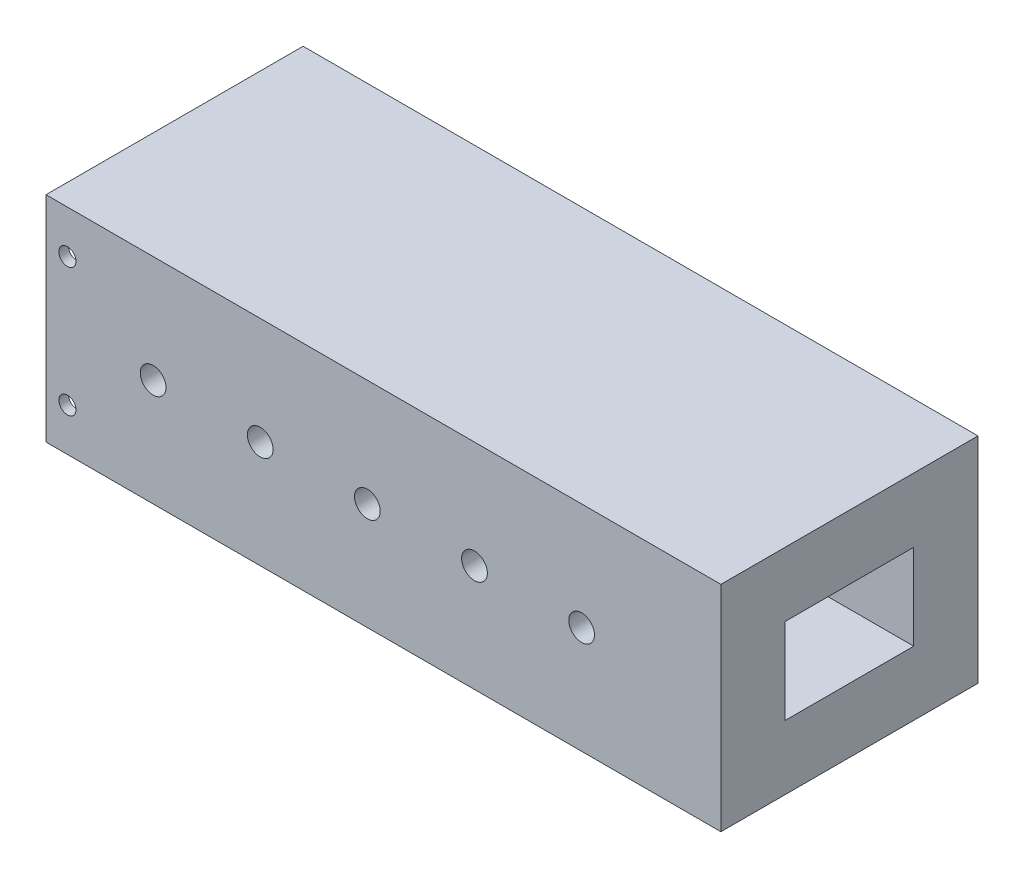
ISO-10303-21;
HEADER;
FILE_DESCRIPTION(('STEP AP214'),'2;1');
FILE_NAME('part.step','',(''),(''),'','','');
FILE_SCHEMA(('AUTOMOTIVE_DESIGN { 1 0 10303 214 1 1 1 1 }'));
ENDSEC;
DATA;
#1=APPLICATION_CONTEXT('core data for automotive mechanical design processes');
#2=APPLICATION_PROTOCOL_DEFINITION('international standard','automotive_design',2000,#1);
#3=PRODUCT_CONTEXT('',#1,'mechanical');
#4=PRODUCT('Part','Part','',(#3));
#5=PRODUCT_RELATED_PRODUCT_CATEGORY('part','',(#4));
#6=PRODUCT_DEFINITION_FORMATION('','',#4);
#7=PRODUCT_DEFINITION_CONTEXT('part definition',#1,'design');
#8=PRODUCT_DEFINITION('design','',#6,#7);
#9=PRODUCT_DEFINITION_SHAPE('','',#8);
#10=(LENGTH_UNIT() NAMED_UNIT(*) SI_UNIT(.MILLI.,.METRE.));
#11=(NAMED_UNIT(*) PLANE_ANGLE_UNIT() SI_UNIT($,.RADIAN.));
#12=(NAMED_UNIT(*) SI_UNIT($,.STERADIAN.) SOLID_ANGLE_UNIT());
#13=UNCERTAINTY_MEASURE_WITH_UNIT(LENGTH_MEASURE(1.E-05),#10,'distance_accuracy_value','');
#14=(GEOMETRIC_REPRESENTATION_CONTEXT(3) GLOBAL_UNCERTAINTY_ASSIGNED_CONTEXT((#13)) GLOBAL_UNIT_ASSIGNED_CONTEXT((#10,
#11,#12)) REPRESENTATION_CONTEXT('',''));
#15=CARTESIAN_POINT('',(0.,0.,0.));
#16=DIRECTION('',(0.,0.,1.));
#17=DIRECTION('',(1.,0.,0.));
#18=AXIS2_PLACEMENT_3D('',#15,#16,#17);
#19=CARTESIAN_POINT('',(10.,35.,15.));
#20=DIRECTION('',(0.,0.,1.));
#21=DIRECTION('',(0.,-1.,0.));
#22=AXIS2_PLACEMENT_3D('',#19,#20,#21);
#23=PLANE('',#22);
#24=DIRECTION('',(0.,1.,0.));
#25=VECTOR('',#24,1.);
#26=CARTESIAN_POINT('',(0.,35.,15.));
#27=LINE('',#26,#25);
#28=CARTESIAN_POINT('',(0.,15.,15.));
#29=VERTEX_POINT('',#28);
#30=CARTESIAN_POINT('',(0.,35.,15.));
#31=VERTEX_POINT('',#30);
#32=EDGE_CURVE('E113',#29,#31,#27,.T.);
#33=ORIENTED_EDGE('',*,*,#32,.F.);
#34=DIRECTION('',(-1.,0.,0.));
#35=VECTOR('',#34,1.);
#36=CARTESIAN_POINT('',(10.,15.,15.));
#37=LINE('',#36,#35);
#38=CARTESIAN_POINT('',(10.,15.,15.));
#39=VERTEX_POINT('',#38);
#40=EDGE_CURVE('E12',#39,#29,#37,.T.);
#41=ORIENTED_EDGE('',*,*,#40,.F.);
#42=DIRECTION('',(0.,1.,0.));
#43=VECTOR('',#42,1.);
#44=CARTESIAN_POINT('',(10.,35.,15.));
#45=LINE('',#44,#43);
#46=CARTESIAN_POINT('',(10.,35.,15.));
#47=VERTEX_POINT('',#46);
#48=EDGE_CURVE('E107',#39,#47,#45,.T.);
#49=ORIENTED_EDGE('',*,*,#48,.T.);
#50=DIRECTION('',(-1.,0.,0.));
#51=VECTOR('',#50,1.);
#52=CARTESIAN_POINT('',(10.,35.,15.));
#53=LINE('',#52,#51);
#54=EDGE_CURVE('E52',#47,#31,#53,.T.);
#55=ORIENTED_EDGE('',*,*,#54,.T.);
#56=EDGE_LOOP('',(#33,#41,#49,#55));
#57=FACE_BOUND('',#56,.T.);
#58=ADVANCED_FACE('F49',(#57),#23,.T.);
#59=CARTESIAN_POINT('',(10.,15.,-15.));
#60=DIRECTION('',(0.,-1.,0.));
#61=DIRECTION('',(0.,0.,-1.));
#62=AXIS2_PLACEMENT_3D('',#59,#60,#61);
#63=PLANE('',#62);
#64=DIRECTION('',(0.,0.,1.));
#65=VECTOR('',#64,1.);
#66=CARTESIAN_POINT('',(0.,15.,-15.));
#67=LINE('',#66,#65);
#68=CARTESIAN_POINT('',(0.,15.,-15.));
#69=VERTEX_POINT('',#68);
#70=EDGE_CURVE('E109',#69,#29,#67,.T.);
#71=ORIENTED_EDGE('',*,*,#70,.F.);
#72=DIRECTION('',(-1.,0.,0.));
#73=VECTOR('',#72,1.);
#74=CARTESIAN_POINT('',(10.,15.,-15.));
#75=LINE('',#74,#73);
#76=CARTESIAN_POINT('',(10.,15.,-15.));
#77=VERTEX_POINT('',#76);
#78=EDGE_CURVE('E58',#77,#69,#75,.T.);
#79=ORIENTED_EDGE('',*,*,#78,.F.);
#80=DIRECTION('',(0.,0.,1.));
#81=VECTOR('',#80,1.);
#82=CARTESIAN_POINT('',(10.,15.,-15.));
#83=LINE('',#82,#81);
#84=EDGE_CURVE('E104',#77,#39,#83,.T.);
#85=ORIENTED_EDGE('',*,*,#84,.T.);
#86=ORIENTED_EDGE('',*,*,#40,.T.);
#87=EDGE_LOOP('',(#71,#79,#85,#86));
#88=FACE_BOUND('',#87,.T.);
#89=ADVANCED_FACE('F123',(#88),#63,.T.);
#90=CARTESIAN_POINT('',(10.,35.,-15.));
#91=DIRECTION('',(0.,0.,-1.));
#92=DIRECTION('',(0.,1.,0.));
#93=AXIS2_PLACEMENT_3D('',#90,#91,#92);
#94=PLANE('',#93);
#95=DIRECTION('',(0.,-1.,0.));
#96=VECTOR('',#95,1.);
#97=CARTESIAN_POINT('',(0.,35.,-15.));
#98=LINE('',#97,#96);
#99=CARTESIAN_POINT('',(0.,35.,-15.));
#100=VERTEX_POINT('',#99);
#101=EDGE_CURVE('E99',#100,#69,#98,.T.);
#102=ORIENTED_EDGE('',*,*,#101,.F.);
#103=DIRECTION('',(-1.,0.,0.));
#104=VECTOR('',#103,1.);
#105=CARTESIAN_POINT('',(10.,35.,-15.));
#106=LINE('',#105,#104);
#107=CARTESIAN_POINT('',(10.,35.,-15.));
#108=VERTEX_POINT('',#107);
#109=EDGE_CURVE('E94',#108,#100,#106,.T.);
#110=ORIENTED_EDGE('',*,*,#109,.F.);
#111=DIRECTION('',(0.,-1.,0.));
#112=VECTOR('',#111,1.);
#113=CARTESIAN_POINT('',(10.,35.,-15.));
#114=LINE('',#113,#112);
#115=EDGE_CURVE('E97',#108,#77,#114,.T.);
#116=ORIENTED_EDGE('',*,*,#115,.T.);
#117=ORIENTED_EDGE('',*,*,#78,.T.);
#118=EDGE_LOOP('',(#102,#110,#116,#117));
#119=FACE_BOUND('',#118,.T.);
#120=ADVANCED_FACE('F96',(#119),#94,.T.);
#121=CARTESIAN_POINT('',(10.,35.,-15.));
#122=DIRECTION('',(0.,1.,0.));
#123=DIRECTION('',(0.,0.,1.));
#124=AXIS2_PLACEMENT_3D('',#121,#122,#123);
#125=PLANE('',#124);
#126=DIRECTION('',(0.,0.,-1.));
#127=VECTOR('',#126,1.);
#128=CARTESIAN_POINT('',(0.,35.,-15.));
#129=LINE('',#128,#127);
#130=EDGE_CURVE('E116',#31,#100,#129,.T.);
#131=ORIENTED_EDGE('',*,*,#130,.F.);
#132=ORIENTED_EDGE('',*,*,#54,.F.);
#133=DIRECTION('',(0.,0.,-1.));
#134=VECTOR('',#133,1.);
#135=CARTESIAN_POINT('',(10.,35.,-15.));
#136=LINE('',#135,#134);
#137=EDGE_CURVE('E103',#47,#108,#136,.T.);
#138=ORIENTED_EDGE('',*,*,#137,.T.);
#139=ORIENTED_EDGE('',*,*,#109,.T.);
#140=EDGE_LOOP('',(#131,#132,#138,#139));
#141=FACE_BOUND('',#140,.T.);
#142=ADVANCED_FACE('F106',(#141),#125,.T.);
#143=CARTESIAN_POINT('',(10.,0.,0.));
#144=DIRECTION('',(-1.,0.,0.));
#145=DIRECTION('',(0.,0.,1.));
#146=AXIS2_PLACEMENT_3D('',#143,#144,#145);
#147=PLANE('',#146);
#148=ORIENTED_EDGE('',*,*,#48,.F.);
#149=ORIENTED_EDGE('',*,*,#84,.F.);
#150=ORIENTED_EDGE('',*,*,#115,.F.);
#151=ORIENTED_EDGE('',*,*,#137,.F.);
#152=EDGE_LOOP('',(#148,#149,#150,#151));
#153=FACE_BOUND('',#152,.T.);
#154=ADVANCED_FACE('F102',(#153),#147,.F.);
#155=CARTESIAN_POINT('',(0.,0.,0.));
#156=DIRECTION('',(-1.,0.,0.));
#157=DIRECTION('',(0.,0.,1.));
#158=AXIS2_PLACEMENT_3D('',#155,#156,#157);
#159=PLANE('',#158);
#160=ORIENTED_EDGE('',*,*,#32,.T.);
#161=ORIENTED_EDGE('',*,*,#130,.T.);
#162=ORIENTED_EDGE('',*,*,#101,.T.);
#163=ORIENTED_EDGE('',*,*,#70,.T.);
#164=EDGE_LOOP('',(#160,#161,#162,#163));
#165=FACE_BOUND('',#164,.T.);
#166=ADVANCED_FACE('F122',(#165),#159,.T.);
#167=CLOSED_SHELL('',(#58,#89,#120,#142,#154,#166));
#168=MANIFOLD_SOLID_BREP('B2',#167);
#169=CARTESIAN_POINT('',(0.,0.,0.));
#170=DIRECTION('',(1.,0.,0.));
#171=DIRECTION('',(0.,0.,-1.));
#172=AXIS2_PLACEMENT_3D('',#169,#170,#171);
#173=PLANE('',#172);
#174=DIRECTION('',(0.,0.,-1.));
#175=VECTOR('',#174,1.);
#176=CARTESIAN_POINT('',(0.,47.75,17.25));
#177=LINE('',#176,#175);
#178=CARTESIAN_POINT('',(0.,47.75,27.75));
#179=VERTEX_POINT('',#178);
#180=CARTESIAN_POINT('',(0.,47.75,17.25));
#181=VERTEX_POINT('',#180);
#182=EDGE_CURVE('E319',#179,#181,#177,.T.);
#183=ORIENTED_EDGE('',*,*,#182,.F.);
#184=DIRECTION('',(0.,1.,0.));
#185=VECTOR('',#184,1.);
#186=CARTESIAN_POINT('',(0.,47.75,27.75));
#187=LINE('',#186,#185);
#188=CARTESIAN_POINT('',(0.,2.25,27.75));
#189=VERTEX_POINT('',#188);
#190=EDGE_CURVE('E189',#189,#179,#187,.T.);
#191=ORIENTED_EDGE('',*,*,#190,.F.);
#192=DIRECTION('',(0.,0.,1.));
#193=VECTOR('',#192,1.);
#194=CARTESIAN_POINT('',(0.,2.25,17.25));
#195=LINE('',#194,#193);
#196=CARTESIAN_POINT('',(0.,2.25,17.25));
#197=VERTEX_POINT('',#196);
#198=EDGE_CURVE('E307',#197,#189,#195,.T.);
#199=ORIENTED_EDGE('',*,*,#198,.F.);
#200=DIRECTION('',(0.,-1.,0.));
#201=VECTOR('',#200,1.);
#202=CARTESIAN_POINT('',(0.,47.75,17.25));
#203=LINE('',#202,#201);
#204=EDGE_CURVE('E310',#181,#197,#203,.T.);
#205=ORIENTED_EDGE('',*,*,#204,.F.);
#206=EDGE_LOOP('',(#183,#191,#199,#205));
#207=FACE_BOUND('',#206,.T.);
#208=DIRECTION('',(0.,0.,-1.));
#209=VECTOR('',#208,1.);
#210=CARTESIAN_POINT('',(0.,47.75,-17.25));
#211=LINE('',#210,#209);
#212=CARTESIAN_POINT('',(0.,47.75,-17.25));
#213=VERTEX_POINT('',#212);
#214=CARTESIAN_POINT('',(0.,47.75,-27.75));
#215=VERTEX_POINT('',#214);
#216=EDGE_CURVE('E346',#213,#215,#211,.T.);
#217=ORIENTED_EDGE('',*,*,#216,.F.);
#218=DIRECTION('',(0.,1.,0.));
#219=VECTOR('',#218,1.);
#220=CARTESIAN_POINT('',(0.,47.75,-17.25));
#221=LINE('',#220,#219);
#222=CARTESIAN_POINT('',(0.,2.25,-17.25));
#223=VERTEX_POINT('',#222);
#224=EDGE_CURVE('E197',#223,#213,#221,.T.);
#225=ORIENTED_EDGE('',*,*,#224,.F.);
#226=DIRECTION('',(0.,0.,1.));
#227=VECTOR('',#226,1.);
#228=CARTESIAN_POINT('',(0.,2.25,-17.25));
#229=LINE('',#228,#227);
#230=CARTESIAN_POINT('',(0.,2.25,-27.75));
#231=VERTEX_POINT('',#230);
#232=EDGE_CURVE('E339',#231,#223,#229,.T.);
#233=ORIENTED_EDGE('',*,*,#232,.F.);
#234=DIRECTION('',(0.,-1.,0.));
#235=VECTOR('',#234,1.);
#236=CARTESIAN_POINT('',(0.,47.75,-27.75));
#237=LINE('',#236,#235);
#238=EDGE_CURVE('E342',#215,#231,#237,.T.);
#239=ORIENTED_EDGE('',*,*,#238,.F.);
#240=EDGE_LOOP('',(#217,#225,#233,#239));
#241=FACE_BOUND('',#240,.T.);
#242=DIRECTION('',(0.,0.,-1.));
#243=VECTOR('',#242,1.);
#244=CARTESIAN_POINT('',(0.,50.,0.));
#245=LINE('',#244,#243);
#246=CARTESIAN_POINT('',(0.,50.,30.));
#247=VERTEX_POINT('',#246);
#248=CARTESIAN_POINT('',(0.,50.,-30.));
#249=VERTEX_POINT('',#248);
#250=EDGE_CURVE('E47',#247,#249,#245,.T.);
#251=ORIENTED_EDGE('',*,*,#250,.T.);
#252=DIRECTION('',(0.,1.,0.));
#253=VECTOR('',#252,1.);
#254=CARTESIAN_POINT('',(0.,50.,-30.));
#255=LINE('',#254,#253);
#256=CARTESIAN_POINT('',(0.,0.,-30.));
#257=VERTEX_POINT('',#256);
#258=EDGE_CURVE('E181',#257,#249,#255,.T.);
#259=ORIENTED_EDGE('',*,*,#258,.F.);
#260=DIRECTION('',(0.,0.,-1.));
#261=VECTOR('',#260,1.);
#262=CARTESIAN_POINT('',(0.,0.,0.));
#263=LINE('',#262,#261);
#264=CARTESIAN_POINT('',(0.,0.,30.));
#265=VERTEX_POINT('',#264);
#266=EDGE_CURVE('E444',#265,#257,#263,.T.);
#267=ORIENTED_EDGE('',*,*,#266,.F.);
#268=DIRECTION('',(0.,-1.,0.));
#269=VECTOR('',#268,1.);
#270=CARTESIAN_POINT('',(0.,50.,30.));
#271=LINE('',#270,#269);
#272=EDGE_CURVE('E446',#247,#265,#271,.T.);
#273=ORIENTED_EDGE('',*,*,#272,.F.);
#274=EDGE_LOOP('',(#251,#259,#267,#273));
#275=FACE_BOUND('',#274,.T.);
#276=DIRECTION('',(0.,0.,1.));
#277=VECTOR('',#276,1.);
#278=CARTESIAN_POINT('',(0.,15.,-15.));
#279=LINE('',#278,#277);
#280=CARTESIAN_POINT('',(0.,15.,-15.));
#281=VERTEX_POINT('',#280);
#282=CARTESIAN_POINT('',(0.,15.,15.));
#283=VERTEX_POINT('',#282);
#284=EDGE_CURVE('E439',#281,#283,#279,.T.);
#285=ORIENTED_EDGE('',*,*,#284,.F.);
#286=DIRECTION('',(0.,-1.,0.));
#287=VECTOR('',#286,1.);
#288=CARTESIAN_POINT('',(0.,35.,-15.));
#289=LINE('',#288,#287);
#290=CARTESIAN_POINT('',(0.,35.,-15.));
#291=VERTEX_POINT('',#290);
#292=EDGE_CURVE('E437',#291,#281,#289,.T.);
#293=ORIENTED_EDGE('',*,*,#292,.F.);
#294=DIRECTION('',(0.,0.,-1.));
#295=VECTOR('',#294,1.);
#296=CARTESIAN_POINT('',(0.,35.,-15.));
#297=LINE('',#296,#295);
#298=CARTESIAN_POINT('',(0.,35.,15.));
#299=VERTEX_POINT('',#298);
#300=EDGE_CURVE('E435',#299,#291,#297,.T.);
#301=ORIENTED_EDGE('',*,*,#300,.F.);
#302=DIRECTION('',(0.,1.,0.));
#303=VECTOR('',#302,1.);
#304=CARTESIAN_POINT('',(0.,35.,15.));
#305=LINE('',#304,#303);
#306=EDGE_CURVE('E442',#283,#299,#305,.T.);
#307=ORIENTED_EDGE('',*,*,#306,.F.);
#308=EDGE_LOOP('',(#285,#293,#301,#307));
#309=FACE_BOUND('',#308,.T.);
#310=ADVANCED_FACE('F173',(#207,#241,#275,#309),#173,.F.);
#311=CARTESIAN_POINT('',(25.,25.,20.));
#312=DIRECTION('',(0.,0.,-1.));
#313=DIRECTION('',(-1.,0.,0.));
#314=AXIS2_PLACEMENT_3D('',#311,#312,#313);
#315=PLANE('',#314);
#316=CARTESIAN_POINT('',(25.,25.,20.));
#317=DIRECTION('',(0.,0.,1.));
#318=DIRECTION('',(-1.,0.,0.));
#319=AXIS2_PLACEMENT_3D('',#316,#317,#318);
#320=CIRCLE('',#319,3.);
#321=CARTESIAN_POINT('',(22.,25.,20.));
#322=VERTEX_POINT('',#321);
#323=EDGE_CURVE('E325',#322,#322,#320,.T.);
#324=ORIENTED_EDGE('',*,*,#323,.T.);
#325=EDGE_LOOP('',(#324));
#326=FACE_BOUND('',#325,.T.);
#327=ADVANCED_FACE('F528',(#326),#315,.F.);
#328=CARTESIAN_POINT('',(125.,24.9999999999993,20.));
#329=DIRECTION('',(0.,0.,-1.));
#330=DIRECTION('',(-1.,0.,0.));
#331=AXIS2_PLACEMENT_3D('',#328,#329,#330);
#332=PLANE('',#331);
#333=CARTESIAN_POINT('',(125.,24.9999999999993,20.));
#334=DIRECTION('',(0.,0.,1.));
#335=DIRECTION('',(-1.,0.,0.));
#336=AXIS2_PLACEMENT_3D('',#333,#334,#335);
#337=CIRCLE('',#336,2.99999999999999);
#338=CARTESIAN_POINT('',(122.,24.9999999999993,20.));
#339=VERTEX_POINT('',#338);
#340=EDGE_CURVE('E381',#339,#339,#337,.T.);
#341=ORIENTED_EDGE('',*,*,#340,.T.);
#342=EDGE_LOOP('',(#341));
#343=FACE_BOUND('',#342,.T.);
#344=ADVANCED_FACE('F534',(#343),#332,.F.);
#345=CARTESIAN_POINT('',(50.,24.9999999999998,20.));
#346=DIRECTION('',(0.,0.,-1.));
#347=DIRECTION('',(-1.,0.,0.));
#348=AXIS2_PLACEMENT_3D('',#345,#346,#347);
#349=PLANE('',#348);
#350=CARTESIAN_POINT('',(50.,24.9999999999998,20.));
#351=DIRECTION('',(0.,0.,1.));
#352=DIRECTION('',(-1.,0.,0.));
#353=AXIS2_PLACEMENT_3D('',#350,#351,#352);
#354=CIRCLE('',#353,3.);
#355=CARTESIAN_POINT('',(47.,24.9999999999998,20.));
#356=VERTEX_POINT('',#355);
#357=EDGE_CURVE('E363',#356,#356,#354,.T.);
#358=ORIENTED_EDGE('',*,*,#357,.T.);
#359=EDGE_LOOP('',(#358));
#360=FACE_BOUND('',#359,.T.);
#361=ADVANCED_FACE('F565',(#360),#349,.F.);
#362=CARTESIAN_POINT('',(75.,24.9999999999997,20.));
#363=DIRECTION('',(0.,0.,-1.));
#364=DIRECTION('',(-1.,0.,0.));
#365=AXIS2_PLACEMENT_3D('',#362,#363,#364);
#366=PLANE('',#365);
#367=CARTESIAN_POINT('',(75.,24.9999999999997,20.));
#368=DIRECTION('',(0.,0.,1.));
#369=DIRECTION('',(-1.,0.,0.));
#370=AXIS2_PLACEMENT_3D('',#367,#368,#369);
#371=CIRCLE('',#370,3.00000000000001);
#372=CARTESIAN_POINT('',(72.,24.9999999999997,20.));
#373=VERTEX_POINT('',#372);
#374=EDGE_CURVE('E370',#373,#373,#371,.T.);
#375=ORIENTED_EDGE('',*,*,#374,.T.);
#376=EDGE_LOOP('',(#375));
#377=FACE_BOUND('',#376,.T.);
#378=ADVANCED_FACE('F576',(#377),#366,.F.);
#379=CARTESIAN_POINT('',(100.,24.9999999999995,20.));
#380=DIRECTION('',(0.,0.,-1.));
#381=DIRECTION('',(-1.,0.,0.));
#382=AXIS2_PLACEMENT_3D('',#379,#380,#381);
#383=PLANE('',#382);
#384=CARTESIAN_POINT('',(100.,24.9999999999995,20.));
#385=DIRECTION('',(0.,0.,1.));
#386=DIRECTION('',(-1.,0.,0.));
#387=AXIS2_PLACEMENT_3D('',#384,#385,#386);
#388=CIRCLE('',#387,2.99999999999999);
#389=CARTESIAN_POINT('',(97.,24.9999999999995,20.));
#390=VERTEX_POINT('',#389);
#391=EDGE_CURVE('E369',#390,#390,#388,.T.);
#392=ORIENTED_EDGE('',*,*,#391,.T.);
#393=EDGE_LOOP('',(#392));
#394=FACE_BOUND('',#393,.T.);
#395=ADVANCED_FACE('F573',(#394),#383,.F.);
#396=CARTESIAN_POINT('',(25.,25.,20.));
#397=DIRECTION('',(0.,0.,1.));
#398=DIRECTION('',(1.,0.,0.));
#399=AXIS2_PLACEMENT_3D('',#396,#397,#398);
#400=CYLINDRICAL_SURFACE('',#399,3.);
#401=ORIENTED_EDGE('',*,*,#323,.F.);
#402=EDGE_LOOP('',(#401));
#403=FACE_BOUND('',#402,.T.);
#404=CARTESIAN_POINT('',(25.,25.,30.));
#405=DIRECTION('',(0.,0.,1.));
#406=DIRECTION('',(-1.,0.,0.));
#407=AXIS2_PLACEMENT_3D('',#404,#405,#406);
#408=CIRCLE('',#407,3.);
#409=CARTESIAN_POINT('',(22.,25.,30.));
#410=VERTEX_POINT('',#409);
#411=EDGE_CURVE('E360',#410,#410,#408,.T.);
#412=ORIENTED_EDGE('',*,*,#411,.T.);
#413=EDGE_LOOP('',(#412));
#414=FACE_BOUND('',#413,.T.);
#415=ADVANCED_FACE('F571',(#403,#414),#400,.F.);
#416=CARTESIAN_POINT('',(125.,24.9999999999993,20.));
#417=DIRECTION('',(0.,0.,1.));
#418=DIRECTION('',(1.,0.,0.));
#419=AXIS2_PLACEMENT_3D('',#416,#417,#418);
#420=CYLINDRICAL_SURFACE('',#419,2.99999999999999);
#421=ORIENTED_EDGE('',*,*,#340,.F.);
#422=EDGE_LOOP('',(#421));
#423=FACE_BOUND('',#422,.T.);
#424=CARTESIAN_POINT('',(125.,24.9999999999993,30.));
#425=DIRECTION('',(0.,0.,1.));
#426=DIRECTION('',(-1.,0.,0.));
#427=AXIS2_PLACEMENT_3D('',#424,#425,#426);
#428=CIRCLE('',#427,2.99999999999999);
#429=CARTESIAN_POINT('',(122.,24.9999999999993,30.));
#430=VERTEX_POINT('',#429);
#431=EDGE_CURVE('E384',#430,#430,#428,.T.);
#432=ORIENTED_EDGE('',*,*,#431,.T.);
#433=EDGE_LOOP('',(#432));
#434=FACE_BOUND('',#433,.T.);
#435=ADVANCED_FACE('F567',(#423,#434),#420,.F.);
#436=CARTESIAN_POINT('',(50.,24.9999999999998,20.));
#437=DIRECTION('',(0.,0.,1.));
#438=DIRECTION('',(1.,0.,0.));
#439=AXIS2_PLACEMENT_3D('',#436,#437,#438);
#440=CYLINDRICAL_SURFACE('',#439,3.);
#441=ORIENTED_EDGE('',*,*,#357,.F.);
#442=EDGE_LOOP('',(#441));
#443=FACE_BOUND('',#442,.T.);
#444=CARTESIAN_POINT('',(50.,24.9999999999998,30.));
#445=DIRECTION('',(0.,0.,1.));
#446=DIRECTION('',(-1.,0.,0.));
#447=AXIS2_PLACEMENT_3D('',#444,#445,#446);
#448=CIRCLE('',#447,3.);
#449=CARTESIAN_POINT('',(47.,24.9999999999998,30.));
#450=VERTEX_POINT('',#449);
#451=EDGE_CURVE('E373',#450,#450,#448,.T.);
#452=ORIENTED_EDGE('',*,*,#451,.T.);
#453=EDGE_LOOP('',(#452));
#454=FACE_BOUND('',#453,.T.);
#455=ADVANCED_FACE('F570',(#443,#454),#440,.F.);
#456=CARTESIAN_POINT('',(75.,24.9999999999997,20.));
#457=DIRECTION('',(0.,0.,1.));
#458=DIRECTION('',(1.,0.,0.));
#459=AXIS2_PLACEMENT_3D('',#456,#457,#458);
#460=CYLINDRICAL_SURFACE('',#459,3.00000000000001);
#461=ORIENTED_EDGE('',*,*,#374,.F.);
#462=EDGE_LOOP('',(#461));
#463=FACE_BOUND('',#462,.T.);
#464=CARTESIAN_POINT('',(75.,24.9999999999997,30.));
#465=DIRECTION('',(0.,0.,1.));
#466=DIRECTION('',(-1.,0.,0.));
#467=AXIS2_PLACEMENT_3D('',#464,#465,#466);
#468=CIRCLE('',#467,3.00000000000001);
#469=CARTESIAN_POINT('',(72.,24.9999999999997,30.));
#470=VERTEX_POINT('',#469);
#471=EDGE_CURVE('E366',#470,#470,#468,.T.);
#472=ORIENTED_EDGE('',*,*,#471,.T.);
#473=EDGE_LOOP('',(#472));
#474=FACE_BOUND('',#473,.T.);
#475=ADVANCED_FACE('F580',(#463,#474),#460,.F.);
#476=CARTESIAN_POINT('',(100.,24.9999999999995,20.));
#477=DIRECTION('',(0.,0.,1.));
#478=DIRECTION('',(1.,0.,0.));
#479=AXIS2_PLACEMENT_3D('',#476,#477,#478);
#480=CYLINDRICAL_SURFACE('',#479,2.99999999999999);
#481=ORIENTED_EDGE('',*,*,#391,.F.);
#482=EDGE_LOOP('',(#481));
#483=FACE_BOUND('',#482,.T.);
#484=CARTESIAN_POINT('',(100.,24.9999999999995,30.));
#485=DIRECTION('',(0.,0.,1.));
#486=DIRECTION('',(-1.,0.,0.));
#487=AXIS2_PLACEMENT_3D('',#484,#485,#486);
#488=CIRCLE('',#487,2.99999999999999);
#489=CARTESIAN_POINT('',(97.,24.9999999999995,30.));
#490=VERTEX_POINT('',#489);
#491=EDGE_CURVE('E378',#490,#490,#488,.T.);
#492=ORIENTED_EDGE('',*,*,#491,.T.);
#493=EDGE_LOOP('',(#492));
#494=FACE_BOUND('',#493,.T.);
#495=ADVANCED_FACE('F561',(#483,#494),#480,.F.);
#496=CARTESIAN_POINT('',(157.5,15.,-15.));
#497=DIRECTION('',(0.,-1.,0.));
#498=DIRECTION('',(0.,0.,-1.));
#499=AXIS2_PLACEMENT_3D('',#496,#497,#498);
#500=PLANE('',#499);
#501=DIRECTION('',(-1.,0.,0.));
#502=VECTOR('',#501,1.);
#503=CARTESIAN_POINT('',(157.5,15.,-15.));
#504=LINE('',#503,#502);
#505=CARTESIAN_POINT('',(157.5,15.,-15.));
#506=VERTEX_POINT('',#505);
#507=EDGE_CURVE('E406',#506,#281,#504,.T.);
#508=ORIENTED_EDGE('',*,*,#507,.T.);
#509=ORIENTED_EDGE('',*,*,#284,.T.);
#510=DIRECTION('',(-1.,0.,0.));
#511=VECTOR('',#510,1.);
#512=CARTESIAN_POINT('',(157.5,15.,15.));
#513=LINE('',#512,#511);
#514=CARTESIAN_POINT('',(157.5,15.,15.));
#515=VERTEX_POINT('',#514);
#516=EDGE_CURVE('E402',#515,#283,#513,.T.);
#517=ORIENTED_EDGE('',*,*,#516,.F.);
#518=DIRECTION('',(0.,0.,1.));
#519=VECTOR('',#518,1.);
#520=CARTESIAN_POINT('',(157.5,15.,-15.));
#521=LINE('',#520,#519);
#522=EDGE_CURVE('E398',#506,#515,#521,.T.);
#523=ORIENTED_EDGE('',*,*,#522,.F.);
#524=EDGE_LOOP('',(#508,#509,#517,#523));
#525=FACE_BOUND('',#524,.T.);
#526=ADVANCED_FACE('F558',(#525),#500,.F.);
#527=CARTESIAN_POINT('',(157.5,50.,-30.));
#528=DIRECTION('',(-1.,0.,0.));
#529=DIRECTION('',(0.,0.,1.));
#530=AXIS2_PLACEMENT_3D('',#527,#528,#529);
#531=PLANE('',#530);
#532=ORIENTED_EDGE('',*,*,#522,.T.);
#533=DIRECTION('',(0.,1.,0.));
#534=VECTOR('',#533,1.);
#535=CARTESIAN_POINT('',(157.5,35.,15.));
#536=LINE('',#535,#534);
#537=CARTESIAN_POINT('',(157.5,35.,15.));
#538=VERTEX_POINT('',#537);
#539=EDGE_CURVE('E387',#515,#538,#536,.T.);
#540=ORIENTED_EDGE('',*,*,#539,.T.);
#541=DIRECTION('',(0.,0.,-1.));
#542=VECTOR('',#541,1.);
#543=CARTESIAN_POINT('',(157.5,35.,-15.));
#544=LINE('',#543,#542);
#545=CARTESIAN_POINT('',(157.5,35.,-15.));
#546=VERTEX_POINT('',#545);
#547=EDGE_CURVE('E392',#538,#546,#544,.T.);
#548=ORIENTED_EDGE('',*,*,#547,.T.);
#549=DIRECTION('',(0.,-1.,0.));
#550=VECTOR('',#549,1.);
#551=CARTESIAN_POINT('',(157.5,35.,-15.));
#552=LINE('',#551,#550);
#553=EDGE_CURVE('E395',#546,#506,#552,.T.);
#554=ORIENTED_EDGE('',*,*,#553,.T.);
#555=EDGE_LOOP('',(#532,#540,#548,#554));
#556=FACE_BOUND('',#555,.T.);
#557=DIRECTION('',(0.,0.,-1.));
#558=VECTOR('',#557,1.);
#559=CARTESIAN_POINT('',(157.5,0.,-30.));
#560=LINE('',#559,#558);
#561=CARTESIAN_POINT('',(157.5,0.,30.));
#562=VERTEX_POINT('',#561);
#563=CARTESIAN_POINT('',(157.5,0.,-30.));
#564=VERTEX_POINT('',#563);
#565=EDGE_CURVE('E405',#562,#564,#560,.T.);
#566=ORIENTED_EDGE('',*,*,#565,.T.);
#567=DIRECTION('',(0.,-1.,0.));
#568=VECTOR('',#567,1.);
#569=CARTESIAN_POINT('',(157.5,50.,-30.));
#570=LINE('',#569,#568);
#571=CARTESIAN_POINT('',(157.5,50.,-30.));
#572=VERTEX_POINT('',#571);
#573=EDGE_CURVE('E432',#572,#564,#570,.T.);
#574=ORIENTED_EDGE('',*,*,#573,.F.);
#575=DIRECTION('',(0.,0.,-1.));
#576=VECTOR('',#575,1.);
#577=CARTESIAN_POINT('',(157.5,50.,-30.));
#578=LINE('',#577,#576);
#579=CARTESIAN_POINT('',(157.5,50.,30.));
#580=VERTEX_POINT('',#579);
#581=EDGE_CURVE('E414',#580,#572,#578,.T.);
#582=ORIENTED_EDGE('',*,*,#581,.F.);
#583=DIRECTION('',(0.,-1.,0.));
#584=VECTOR('',#583,1.);
#585=CARTESIAN_POINT('',(157.5,50.,30.));
#586=LINE('',#585,#584);
#587=EDGE_CURVE('E423',#580,#562,#586,.T.);
#588=ORIENTED_EDGE('',*,*,#587,.T.);
#589=EDGE_LOOP('',(#566,#574,#582,#588));
#590=FACE_BOUND('',#589,.T.);
#591=ADVANCED_FACE('F512',(#556,#590),#531,.F.);
#592=CARTESIAN_POINT('',(157.5,35.,-15.));
#593=DIRECTION('',(0.,0.,-1.));
#594=DIRECTION('',(0.,1.,0.));
#595=AXIS2_PLACEMENT_3D('',#592,#593,#594);
#596=PLANE('',#595);
#597=DIRECTION('',(-1.,0.,0.));
#598=VECTOR('',#597,1.);
#599=CARTESIAN_POINT('',(157.5,35.,-15.));
#600=LINE('',#599,#598);
#601=EDGE_CURVE('E409',#546,#291,#600,.T.);
#602=ORIENTED_EDGE('',*,*,#601,.T.);
#603=ORIENTED_EDGE('',*,*,#292,.T.);
#604=ORIENTED_EDGE('',*,*,#507,.F.);
#605=ORIENTED_EDGE('',*,*,#553,.F.);
#606=EDGE_LOOP('',(#602,#603,#604,#605));
#607=FACE_BOUND('',#606,.T.);
#608=ADVANCED_FACE('F552',(#607),#596,.F.);
#609=CARTESIAN_POINT('',(157.5,35.,15.));
#610=DIRECTION('',(0.,0.,1.));
#611=DIRECTION('',(0.,-1.,0.));
#612=AXIS2_PLACEMENT_3D('',#609,#610,#611);
#613=PLANE('',#612);
#614=ORIENTED_EDGE('',*,*,#516,.T.);
#615=ORIENTED_EDGE('',*,*,#306,.T.);
#616=DIRECTION('',(-1.,0.,0.));
#617=VECTOR('',#616,1.);
#618=CARTESIAN_POINT('',(157.5,35.,15.));
#619=LINE('',#618,#617);
#620=EDGE_CURVE('E401',#538,#299,#619,.T.);
#621=ORIENTED_EDGE('',*,*,#620,.F.);
#622=ORIENTED_EDGE('',*,*,#539,.F.);
#623=EDGE_LOOP('',(#614,#615,#621,#622));
#624=FACE_BOUND('',#623,.T.);
#625=ADVANCED_FACE('F522',(#624),#613,.F.);
#626=CARTESIAN_POINT('',(157.5,35.,-15.));
#627=DIRECTION('',(0.,1.,0.));
#628=DIRECTION('',(0.,0.,1.));
#629=AXIS2_PLACEMENT_3D('',#626,#627,#628);
#630=PLANE('',#629);
#631=ORIENTED_EDGE('',*,*,#620,.T.);
#632=ORIENTED_EDGE('',*,*,#300,.T.);
#633=ORIENTED_EDGE('',*,*,#601,.F.);
#634=ORIENTED_EDGE('',*,*,#547,.F.);
#635=EDGE_LOOP('',(#631,#632,#633,#634));
#636=FACE_BOUND('',#635,.T.);
#637=ADVANCED_FACE('F515',(#636),#630,.F.);
#638=CARTESIAN_POINT('',(-157.5,50.,-30.));
#639=DIRECTION('',(0.,0.,1.));
#640=DIRECTION('',(1.,0.,0.));
#641=AXIS2_PLACEMENT_3D('',#638,#639,#640);
#642=PLANE('',#641);
#643=CARTESIAN_POINT('',(30.,10.,-30.));
#644=DIRECTION('',(0.,0.,-1.));
#645=DIRECTION('',(-1.,0.,0.));
#646=AXIS2_PLACEMENT_3D('',#643,#644,#645);
#647=CIRCLE('',#646,2.);
#648=CARTESIAN_POINT('',(28.,10.,-30.));
#649=VERTEX_POINT('',#648);
#650=EDGE_CURVE('E679',#649,#649,#647,.T.);
#651=ORIENTED_EDGE('',*,*,#650,.F.);
#652=EDGE_LOOP('',(#651));
#653=FACE_BOUND('',#652,.T.);
#654=CARTESIAN_POINT('',(30.,40.,-30.));
#655=DIRECTION('',(0.,0.,-1.));
#656=DIRECTION('',(1.,0.,0.));
#657=AXIS2_PLACEMENT_3D('',#654,#655,#656);
#658=CIRCLE('',#657,2.);
#659=CARTESIAN_POINT('',(32.,40.,-30.));
#660=VERTEX_POINT('',#659);
#661=EDGE_CURVE('E683',#660,#660,#658,.T.);
#662=ORIENTED_EDGE('',*,*,#661,.F.);
#663=EDGE_LOOP('',(#662));
#664=FACE_BOUND('',#663,.T.);
#665=CARTESIAN_POINT('',(5.,40.,-30.));
#666=DIRECTION('',(0.,0.,1.));
#667=DIRECTION('',(1.,0.,0.));
#668=AXIS2_PLACEMENT_3D('',#665,#666,#667);
#669=CIRCLE('',#668,2.);
#670=CARTESIAN_POINT('',(7.,40.,-30.));
#671=VERTEX_POINT('',#670);
#672=EDGE_CURVE('E456',#671,#671,#669,.T.);
#673=ORIENTED_EDGE('',*,*,#672,.T.);
#674=EDGE_LOOP('',(#673));
#675=FACE_BOUND('',#674,.T.);
#676=CARTESIAN_POINT('',(5.,10.,-30.));
#677=DIRECTION('',(0.,0.,1.));
#678=DIRECTION('',(-1.,0.,0.));
#679=AXIS2_PLACEMENT_3D('',#676,#677,#678);
#680=CIRCLE('',#679,2.);
#681=CARTESIAN_POINT('',(3.,10.,-30.));
#682=VERTEX_POINT('',#681);
#683=EDGE_CURVE('E461',#682,#682,#680,.T.);
#684=ORIENTED_EDGE('',*,*,#683,.T.);
#685=EDGE_LOOP('',(#684));
#686=FACE_BOUND('',#685,.T.);
#687=DIRECTION('',(-1.,0.,0.));
#688=VECTOR('',#687,1.);
#689=CARTESIAN_POINT('',(-157.5,0.,-30.));
#690=LINE('',#689,#688);
#691=EDGE_CURVE('E426',#564,#257,#690,.T.);
#692=ORIENTED_EDGE('',*,*,#691,.T.);
#693=ORIENTED_EDGE('',*,*,#258,.T.);
#694=DIRECTION('',(-1.,0.,0.));
#695=VECTOR('',#694,1.);
#696=CARTESIAN_POINT('',(-157.5,50.,-30.));
#697=LINE('',#696,#695);
#698=EDGE_CURVE('E417',#572,#249,#697,.T.);
#699=ORIENTED_EDGE('',*,*,#698,.F.);
#700=ORIENTED_EDGE('',*,*,#573,.T.);
#701=EDGE_LOOP('',(#692,#693,#699,#700));
#702=FACE_BOUND('',#701,.T.);
#703=ADVANCED_FACE('F484',(#653,#664,#675,#686,#702),#642,.F.);
#704=CARTESIAN_POINT('',(-157.5,50.,30.));
#705=DIRECTION('',(0.,0.,-1.));
#706=DIRECTION('',(-1.,0.,0.));
#707=AXIS2_PLACEMENT_3D('',#704,#705,#706);
#708=PLANE('',#707);
#709=CARTESIAN_POINT('',(5.,40.,30.));
#710=DIRECTION('',(0.,0.,1.));
#711=DIRECTION('',(1.,0.,0.));
#712=AXIS2_PLACEMENT_3D('',#709,#710,#711);
#713=CIRCLE('',#712,2.);
#714=CARTESIAN_POINT('',(7.,40.,30.));
#715=VERTEX_POINT('',#714);
#716=EDGE_CURVE('E452',#715,#715,#713,.T.);
#717=ORIENTED_EDGE('',*,*,#716,.F.);
#718=EDGE_LOOP('',(#717));
#719=FACE_BOUND('',#718,.T.);
#720=CARTESIAN_POINT('',(5.,10.,30.));
#721=DIRECTION('',(0.,0.,1.));
#722=DIRECTION('',(-1.,0.,0.));
#723=AXIS2_PLACEMENT_3D('',#720,#721,#722);
#724=CIRCLE('',#723,2.);
#725=CARTESIAN_POINT('',(3.,10.,30.));
#726=VERTEX_POINT('',#725);
#727=EDGE_CURVE('E313',#726,#726,#724,.T.);
#728=ORIENTED_EDGE('',*,*,#727,.F.);
#729=EDGE_LOOP('',(#728));
#730=FACE_BOUND('',#729,.T.);
#731=ORIENTED_EDGE('',*,*,#491,.F.);
#732=EDGE_LOOP('',(#731));
#733=FACE_BOUND('',#732,.T.);
#734=ORIENTED_EDGE('',*,*,#471,.F.);
#735=EDGE_LOOP('',(#734));
#736=FACE_BOUND('',#735,.T.);
#737=ORIENTED_EDGE('',*,*,#451,.F.);
#738=EDGE_LOOP('',(#737));
#739=FACE_BOUND('',#738,.T.);
#740=ORIENTED_EDGE('',*,*,#431,.F.);
#741=EDGE_LOOP('',(#740));
#742=FACE_BOUND('',#741,.T.);
#743=ORIENTED_EDGE('',*,*,#411,.F.);
#744=EDGE_LOOP('',(#743));
#745=FACE_BOUND('',#744,.T.);
#746=DIRECTION('',(1.,0.,0.));
#747=VECTOR('',#746,1.);
#748=CARTESIAN_POINT('',(-157.5,50.,30.));
#749=LINE('',#748,#747);
#750=EDGE_CURVE('E421',#247,#580,#749,.T.);
#751=ORIENTED_EDGE('',*,*,#750,.F.);
#752=ORIENTED_EDGE('',*,*,#272,.T.);
#753=DIRECTION('',(1.,0.,0.));
#754=VECTOR('',#753,1.);
#755=CARTESIAN_POINT('',(-157.5,0.,30.));
#756=LINE('',#755,#754);
#757=EDGE_CURVE('E418',#265,#562,#756,.T.);
#758=ORIENTED_EDGE('',*,*,#757,.T.);
#759=ORIENTED_EDGE('',*,*,#587,.F.);
#760=EDGE_LOOP('',(#751,#752,#758,#759));
#761=FACE_BOUND('',#760,.T.);
#762=ADVANCED_FACE('F480',(#719,#730,#733,#736,#739,#742,#745,#761),#708,.F.);
#763=CARTESIAN_POINT('',(0.,0.,0.));
#764=DIRECTION('',(0.,1.,0.));
#765=DIRECTION('',(0.,0.,1.));
#766=AXIS2_PLACEMENT_3D('',#763,#764,#765);
#767=PLANE('',#766);
#768=CARTESIAN_POINT('',(137.5,0.,15.));
#769=DIRECTION('',(0.,-1.,0.));
#770=DIRECTION('',(0.,0.,-1.));
#771=AXIS2_PLACEMENT_3D('',#768,#769,#770);
#772=CIRCLE('',#771,2.);
#773=CARTESIAN_POINT('',(137.5,0.,13.));
#774=VERTEX_POINT('',#773);
#775=EDGE_CURVE('E693',#774,#774,#772,.T.);
#776=ORIENTED_EDGE('',*,*,#775,.F.);
#777=EDGE_LOOP('',(#776));
#778=FACE_BOUND('',#777,.T.);
#779=CARTESIAN_POINT('',(137.5,0.,-15.));
#780=DIRECTION('',(0.,-1.,0.));
#781=DIRECTION('',(0.,0.,1.));
#782=AXIS2_PLACEMENT_3D('',#779,#780,#781);
#783=CIRCLE('',#782,2.);
#784=CARTESIAN_POINT('',(137.5,0.,-13.));
#785=VERTEX_POINT('',#784);
#786=EDGE_CURVE('E682',#785,#785,#783,.T.);
#787=ORIENTED_EDGE('',*,*,#786,.F.);
#788=EDGE_LOOP('',(#787));
#789=FACE_BOUND('',#788,.T.);
#790=ORIENTED_EDGE('',*,*,#757,.F.);
#791=ORIENTED_EDGE('',*,*,#266,.T.);
#792=ORIENTED_EDGE('',*,*,#691,.F.);
#793=ORIENTED_EDGE('',*,*,#565,.F.);
#794=EDGE_LOOP('',(#790,#791,#792,#793));
#795=FACE_BOUND('',#794,.T.);
#796=ADVANCED_FACE('F483',(#778,#789,#795),#767,.F.);
#797=CARTESIAN_POINT('',(0.,50.,0.));
#798=DIRECTION('',(0.,1.,0.));
#799=DIRECTION('',(0.,0.,1.));
#800=AXIS2_PLACEMENT_3D('',#797,#798,#799);
#801=PLANE('',#800);
#802=ORIENTED_EDGE('',*,*,#250,.F.);
#803=ORIENTED_EDGE('',*,*,#750,.T.);
#804=ORIENTED_EDGE('',*,*,#581,.T.);
#805=ORIENTED_EDGE('',*,*,#698,.T.);
#806=EDGE_LOOP('',(#802,#803,#804,#805));
#807=FACE_BOUND('',#806,.T.);
#808=ADVANCED_FACE('F503',(#807),#801,.T.);
#809=CARTESIAN_POINT('',(10.,47.75,-17.25));
#810=DIRECTION('',(0.,0.,1.));
#811=DIRECTION('',(0.,-1.,0.));
#812=AXIS2_PLACEMENT_3D('',#809,#810,#811);
#813=PLANE('',#812);
#814=ORIENTED_EDGE('',*,*,#224,.T.);
#815=DIRECTION('',(-1.,0.,0.));
#816=VECTOR('',#815,1.);
#817=CARTESIAN_POINT('',(10.,47.75,-17.25));
#818=LINE('',#817,#816);
#819=CARTESIAN_POINT('',(10.,47.75,-17.25));
#820=VERTEX_POINT('',#819);
#821=EDGE_CURVE('E329',#820,#213,#818,.T.);
#822=ORIENTED_EDGE('',*,*,#821,.F.);
#823=DIRECTION('',(0.,1.,0.));
#824=VECTOR('',#823,1.);
#825=CARTESIAN_POINT('',(10.,47.75,-17.25));
#826=LINE('',#825,#824);
#827=CARTESIAN_POINT('',(10.,2.25,-17.25));
#828=VERTEX_POINT('',#827);
#829=EDGE_CURVE('E343',#828,#820,#826,.T.);
#830=ORIENTED_EDGE('',*,*,#829,.F.);
#831=DIRECTION('',(-1.,0.,0.));
#832=VECTOR('',#831,1.);
#833=CARTESIAN_POINT('',(10.,2.25,-17.25));
#834=LINE('',#833,#832);
#835=EDGE_CURVE('E336',#828,#223,#834,.T.);
#836=ORIENTED_EDGE('',*,*,#835,.T.);
#837=EDGE_LOOP('',(#814,#822,#830,#836));
#838=FACE_BOUND('',#837,.T.);
#839=ADVANCED_FACE('F537',(#838),#813,.F.);
#840=CARTESIAN_POINT('',(10.,2.25,-17.25));
#841=DIRECTION('',(0.,-1.,0.));
#842=DIRECTION('',(0.,0.,-1.));
#843=AXIS2_PLACEMENT_3D('',#840,#841,#842);
#844=PLANE('',#843);
#845=ORIENTED_EDGE('',*,*,#232,.T.);
#846=ORIENTED_EDGE('',*,*,#835,.F.);
#847=DIRECTION('',(0.,0.,1.));
#848=VECTOR('',#847,1.);
#849=CARTESIAN_POINT('',(10.,2.25,-17.25));
#850=LINE('',#849,#848);
#851=CARTESIAN_POINT('',(10.,2.25,-27.75));
#852=VERTEX_POINT('',#851);
#853=EDGE_CURVE('E331',#852,#828,#850,.T.);
#854=ORIENTED_EDGE('',*,*,#853,.F.);
#855=DIRECTION('',(-1.,0.,0.));
#856=VECTOR('',#855,1.);
#857=CARTESIAN_POINT('',(10.,2.25,-27.75));
#858=LINE('',#857,#856);
#859=EDGE_CURVE('E334',#852,#231,#858,.T.);
#860=ORIENTED_EDGE('',*,*,#859,.T.);
#861=EDGE_LOOP('',(#845,#846,#854,#860));
#862=FACE_BOUND('',#861,.T.);
#863=ADVANCED_FACE('F546',(#862),#844,.F.);
#864=CARTESIAN_POINT('',(10.,47.75,-27.75));
#865=DIRECTION('',(0.,0.,-1.));
#866=DIRECTION('',(0.,1.,0.));
#867=AXIS2_PLACEMENT_3D('',#864,#865,#866);
#868=PLANE('',#867);
#869=CARTESIAN_POINT('',(5.,40.,-27.75));
#870=DIRECTION('',(0.,0.,-1.));
#871=DIRECTION('',(0.,1.,0.));
#872=AXIS2_PLACEMENT_3D('',#869,#870,#871);
#873=CIRCLE('',#872,2.);
#874=CARTESIAN_POINT('',(5.,42.,-27.75));
#875=VERTEX_POINT('',#874);
#876=EDGE_CURVE('E176',#875,#875,#873,.F.);
#877=ORIENTED_EDGE('',*,*,#876,.F.);
#878=EDGE_LOOP('',(#877));
#879=FACE_BOUND('',#878,.T.);
#880=CARTESIAN_POINT('',(5.,10.,-27.75));
#881=DIRECTION('',(0.,0.,-1.));
#882=DIRECTION('',(0.,1.,0.));
#883=AXIS2_PLACEMENT_3D('',#880,#881,#882);
#884=CIRCLE('',#883,2.);
#885=CARTESIAN_POINT('',(5.,12.,-27.75));
#886=VERTEX_POINT('',#885);
#887=EDGE_CURVE('E454',#886,#886,#884,.F.);
#888=ORIENTED_EDGE('',*,*,#887,.F.);
#889=EDGE_LOOP('',(#888));
#890=FACE_BOUND('',#889,.T.);
#891=ORIENTED_EDGE('',*,*,#238,.T.);
#892=ORIENTED_EDGE('',*,*,#859,.F.);
#893=DIRECTION('',(0.,-1.,0.));
#894=VECTOR('',#893,1.);
#895=CARTESIAN_POINT('',(10.,47.75,-27.75));
#896=LINE('',#895,#894);
#897=CARTESIAN_POINT('',(10.,47.75,-27.75));
#898=VERTEX_POINT('',#897);
#899=EDGE_CURVE('E352',#898,#852,#896,.T.);
#900=ORIENTED_EDGE('',*,*,#899,.F.);
#901=DIRECTION('',(-1.,0.,0.));
#902=VECTOR('',#901,1.);
#903=CARTESIAN_POINT('',(10.,47.75,-27.75));
#904=LINE('',#903,#902);
#905=EDGE_CURVE('E332',#898,#215,#904,.T.);
#906=ORIENTED_EDGE('',*,*,#905,.T.);
#907=EDGE_LOOP('',(#891,#892,#900,#906));
#908=FACE_BOUND('',#907,.T.);
#909=ADVANCED_FACE('F604',(#879,#890,#908),#868,.F.);
#910=CARTESIAN_POINT('',(10.,47.75,-17.25));
#911=DIRECTION('',(0.,1.,0.));
#912=DIRECTION('',(0.,0.,1.));
#913=AXIS2_PLACEMENT_3D('',#910,#911,#912);
#914=PLANE('',#913);
#915=ORIENTED_EDGE('',*,*,#216,.T.);
#916=ORIENTED_EDGE('',*,*,#905,.F.);
#917=DIRECTION('',(0.,0.,-1.));
#918=VECTOR('',#917,1.);
#919=CARTESIAN_POINT('',(10.,47.75,-17.25));
#920=LINE('',#919,#918);
#921=EDGE_CURVE('E355',#820,#898,#920,.T.);
#922=ORIENTED_EDGE('',*,*,#921,.F.);
#923=ORIENTED_EDGE('',*,*,#821,.T.);
#924=EDGE_LOOP('',(#915,#916,#922,#923));
#925=FACE_BOUND('',#924,.T.);
#926=ADVANCED_FACE('F600',(#925),#914,.F.);
#927=CARTESIAN_POINT('',(10.,0.,0.));
#928=DIRECTION('',(1.,0.,0.));
#929=DIRECTION('',(0.,0.,-1.));
#930=AXIS2_PLACEMENT_3D('',#927,#928,#929);
#931=PLANE('',#930);
#932=ORIENTED_EDGE('',*,*,#829,.T.);
#933=ORIENTED_EDGE('',*,*,#921,.T.);
#934=ORIENTED_EDGE('',*,*,#899,.T.);
#935=ORIENTED_EDGE('',*,*,#853,.T.);
#936=EDGE_LOOP('',(#932,#933,#934,#935));
#937=FACE_BOUND('',#936,.T.);
#938=ADVANCED_FACE('F597',(#937),#931,.F.);
#939=CARTESIAN_POINT('',(10.,47.75,27.75));
#940=DIRECTION('',(0.,0.,1.));
#941=DIRECTION('',(0.,-1.,0.));
#942=AXIS2_PLACEMENT_3D('',#939,#940,#941);
#943=PLANE('',#942);
#944=CARTESIAN_POINT('',(5.,40.,27.75));
#945=DIRECTION('',(0.,0.,1.));
#946=DIRECTION('',(0.,-1.,0.));
#947=AXIS2_PLACEMENT_3D('',#944,#945,#946);
#948=CIRCLE('',#947,2.);
#949=CARTESIAN_POINT('',(5.,38.,27.75));
#950=VERTEX_POINT('',#949);
#951=EDGE_CURVE('E338',#950,#950,#948,.T.);
#952=ORIENTED_EDGE('',*,*,#951,.T.);
#953=EDGE_LOOP('',(#952));
#954=FACE_BOUND('',#953,.T.);
#955=CARTESIAN_POINT('',(5.,10.,27.75));
#956=DIRECTION('',(0.,0.,1.));
#957=DIRECTION('',(0.,-1.,0.));
#958=AXIS2_PLACEMENT_3D('',#955,#956,#957);
#959=CIRCLE('',#958,2.);
#960=CARTESIAN_POINT('',(5.,8.,27.75));
#961=VERTEX_POINT('',#960);
#962=EDGE_CURVE('E449',#961,#961,#959,.T.);
#963=ORIENTED_EDGE('',*,*,#962,.T.);
#964=EDGE_LOOP('',(#963));
#965=FACE_BOUND('',#964,.T.);
#966=ORIENTED_EDGE('',*,*,#190,.T.);
#967=DIRECTION('',(-1.,0.,0.));
#968=VECTOR('',#967,1.);
#969=CARTESIAN_POINT('',(10.,47.75,27.75));
#970=LINE('',#969,#968);
#971=CARTESIAN_POINT('',(10.,47.75,27.75));
#972=VERTEX_POINT('',#971);
#973=EDGE_CURVE('E285',#972,#179,#970,.T.);
#974=ORIENTED_EDGE('',*,*,#973,.F.);
#975=DIRECTION('',(0.,1.,0.));
#976=VECTOR('',#975,1.);
#977=CARTESIAN_POINT('',(10.,47.75,27.75));
#978=LINE('',#977,#976);
#979=CARTESIAN_POINT('',(10.,2.25,27.75));
#980=VERTEX_POINT('',#979);
#981=EDGE_CURVE('E289',#980,#972,#978,.T.);
#982=ORIENTED_EDGE('',*,*,#981,.F.);
#983=DIRECTION('',(-1.,0.,0.));
#984=VECTOR('',#983,1.);
#985=CARTESIAN_POINT('',(10.,2.25,27.75));
#986=LINE('',#985,#984);
#987=EDGE_CURVE('E323',#980,#189,#986,.T.);
#988=ORIENTED_EDGE('',*,*,#987,.T.);
#989=EDGE_LOOP('',(#966,#974,#982,#988));
#990=FACE_BOUND('',#989,.T.);
#991=ADVANCED_FACE('F287',(#954,#965,#990),#943,.F.);
#992=CARTESIAN_POINT('',(10.,2.25,17.25));
#993=DIRECTION('',(0.,-1.,0.));
#994=DIRECTION('',(0.,0.,-1.));
#995=AXIS2_PLACEMENT_3D('',#992,#993,#994);
#996=PLANE('',#995);
#997=ORIENTED_EDGE('',*,*,#198,.T.);
#998=ORIENTED_EDGE('',*,*,#987,.F.);
#999=DIRECTION('',(0.,0.,1.));
#1000=VECTOR('',#999,1.);
#1001=CARTESIAN_POINT('',(10.,2.25,17.25));
#1002=LINE('',#1001,#1000);
#1003=CARTESIAN_POINT('',(10.,2.25,17.25));
#1004=VERTEX_POINT('',#1003);
#1005=EDGE_CURVE('E295',#1004,#980,#1002,.T.);
#1006=ORIENTED_EDGE('',*,*,#1005,.F.);
#1007=DIRECTION('',(-1.,0.,0.));
#1008=VECTOR('',#1007,1.);
#1009=CARTESIAN_POINT('',(10.,2.25,17.25));
#1010=LINE('',#1009,#1008);
#1011=EDGE_CURVE('E326',#1004,#197,#1010,.T.);
#1012=ORIENTED_EDGE('',*,*,#1011,.T.);
#1013=EDGE_LOOP('',(#997,#998,#1006,#1012));
#1014=FACE_BOUND('',#1013,.T.);
#1015=ADVANCED_FACE('F614',(#1014),#996,.F.);
#1016=CARTESIAN_POINT('',(10.,47.75,17.25));
#1017=DIRECTION('',(0.,0.,-1.));
#1018=DIRECTION('',(0.,1.,0.));
#1019=AXIS2_PLACEMENT_3D('',#1016,#1017,#1018);
#1020=PLANE('',#1019);
#1021=ORIENTED_EDGE('',*,*,#204,.T.);
#1022=ORIENTED_EDGE('',*,*,#1011,.F.);
#1023=DIRECTION('',(0.,-1.,0.));
#1024=VECTOR('',#1023,1.);
#1025=CARTESIAN_POINT('',(10.,47.75,17.25));
#1026=LINE('',#1025,#1024);
#1027=CARTESIAN_POINT('',(10.,47.75,17.25));
#1028=VERTEX_POINT('',#1027);
#1029=EDGE_CURVE('E303',#1028,#1004,#1026,.T.);
#1030=ORIENTED_EDGE('',*,*,#1029,.F.);
#1031=DIRECTION('',(-1.,0.,0.));
#1032=VECTOR('',#1031,1.);
#1033=CARTESIAN_POINT('',(10.,47.75,17.25));
#1034=LINE('',#1033,#1032);
#1035=EDGE_CURVE('E294',#1028,#181,#1034,.T.);
#1036=ORIENTED_EDGE('',*,*,#1035,.T.);
#1037=EDGE_LOOP('',(#1021,#1022,#1030,#1036));
#1038=FACE_BOUND('',#1037,.T.);
#1039=ADVANCED_FACE('F618',(#1038),#1020,.F.);
#1040=CARTESIAN_POINT('',(10.,47.75,17.25));
#1041=DIRECTION('',(0.,1.,0.));
#1042=DIRECTION('',(0.,0.,1.));
#1043=AXIS2_PLACEMENT_3D('',#1040,#1041,#1042);
#1044=PLANE('',#1043);
#1045=ORIENTED_EDGE('',*,*,#182,.T.);
#1046=ORIENTED_EDGE('',*,*,#1035,.F.);
#1047=DIRECTION('',(0.,0.,-1.));
#1048=VECTOR('',#1047,1.);
#1049=CARTESIAN_POINT('',(10.,47.75,17.25));
#1050=LINE('',#1049,#1048);
#1051=EDGE_CURVE('E298',#972,#1028,#1050,.T.);
#1052=ORIENTED_EDGE('',*,*,#1051,.F.);
#1053=ORIENTED_EDGE('',*,*,#973,.T.);
#1054=EDGE_LOOP('',(#1045,#1046,#1052,#1053));
#1055=FACE_BOUND('',#1054,.T.);
#1056=ADVANCED_FACE('F299',(#1055),#1044,.F.);
#1057=CARTESIAN_POINT('',(10.,0.,0.));
#1058=DIRECTION('',(-1.,0.,0.));
#1059=DIRECTION('',(0.,0.,1.));
#1060=AXIS2_PLACEMENT_3D('',#1057,#1058,#1059);
#1061=PLANE('',#1060);
#1062=ORIENTED_EDGE('',*,*,#981,.T.);
#1063=ORIENTED_EDGE('',*,*,#1051,.T.);
#1064=ORIENTED_EDGE('',*,*,#1029,.T.);
#1065=ORIENTED_EDGE('',*,*,#1005,.T.);
#1066=EDGE_LOOP('',(#1062,#1063,#1064,#1065));
#1067=FACE_BOUND('',#1066,.T.);
#1068=ADVANCED_FACE('F305',(#1067),#1061,.T.);
#1069=CARTESIAN_POINT('',(5.,10.,20.));
#1070=DIRECTION('',(0.,0.,1.));
#1071=DIRECTION('',(1.,0.,0.));
#1072=AXIS2_PLACEMENT_3D('',#1069,#1070,#1071);
#1073=CYLINDRICAL_SURFACE('',#1072,2.);
#1074=ORIENTED_EDGE('',*,*,#727,.T.);
#1075=EDGE_LOOP('',(#1074));
#1076=FACE_BOUND('',#1075,.T.);
#1077=ORIENTED_EDGE('',*,*,#962,.F.);
#1078=EDGE_LOOP('',(#1077));
#1079=FACE_BOUND('',#1078,.T.);
#1080=ADVANCED_FACE('F477',(#1076,#1079),#1073,.F.);
#1081=CARTESIAN_POINT('',(5.,40.,20.));
#1082=DIRECTION('',(0.,0.,1.));
#1083=DIRECTION('',(1.,0.,0.));
#1084=AXIS2_PLACEMENT_3D('',#1081,#1082,#1083);
#1085=CYLINDRICAL_SURFACE('',#1084,2.);
#1086=ORIENTED_EDGE('',*,*,#716,.T.);
#1087=EDGE_LOOP('',(#1086));
#1088=FACE_BOUND('',#1087,.T.);
#1089=ORIENTED_EDGE('',*,*,#951,.F.);
#1090=EDGE_LOOP('',(#1089));
#1091=FACE_BOUND('',#1090,.T.);
#1092=ADVANCED_FACE('F629',(#1088,#1091),#1085,.F.);
#1093=CARTESIAN_POINT('',(5.,10.,-20.));
#1094=DIRECTION('',(0.,0.,-1.));
#1095=DIRECTION('',(-1.,0.,0.));
#1096=AXIS2_PLACEMENT_3D('',#1093,#1094,#1095);
#1097=CYLINDRICAL_SURFACE('',#1096,2.);
#1098=ORIENTED_EDGE('',*,*,#683,.F.);
#1099=EDGE_LOOP('',(#1098));
#1100=FACE_BOUND('',#1099,.T.);
#1101=ORIENTED_EDGE('',*,*,#887,.T.);
#1102=EDGE_LOOP('',(#1101));
#1103=FACE_BOUND('',#1102,.T.);
#1104=ADVANCED_FACE('F632',(#1100,#1103),#1097,.F.);
#1105=CARTESIAN_POINT('',(5.,40.,-20.));
#1106=DIRECTION('',(0.,0.,-1.));
#1107=DIRECTION('',(-1.,0.,0.));
#1108=AXIS2_PLACEMENT_3D('',#1105,#1106,#1107);
#1109=CYLINDRICAL_SURFACE('',#1108,2.);
#1110=ORIENTED_EDGE('',*,*,#672,.F.);
#1111=EDGE_LOOP('',(#1110));
#1112=FACE_BOUND('',#1111,.T.);
#1113=ORIENTED_EDGE('',*,*,#876,.T.);
#1114=EDGE_LOOP('',(#1113));
#1115=FACE_BOUND('',#1114,.T.);
#1116=ADVANCED_FACE('F635',(#1112,#1115),#1109,.F.);
#1117=CARTESIAN_POINT('',(137.5,10.,-15.));
#1118=DIRECTION('',(0.,-1.,0.));
#1119=DIRECTION('',(0.,0.,-1.));
#1120=AXIS2_PLACEMENT_3D('',#1117,#1118,#1119);
#1121=CYLINDRICAL_SURFACE('',#1120,2.);
#1122=CARTESIAN_POINT('',(137.5,10.,-15.));
#1123=DIRECTION('',(0.,-1.,0.));
#1124=DIRECTION('',(0.,0.,1.));
#1125=AXIS2_PLACEMENT_3D('',#1122,#1123,#1124);
#1126=CIRCLE('',#1125,2.);
#1127=CARTESIAN_POINT('',(137.5,10.,-13.));
#1128=VERTEX_POINT('',#1127);
#1129=EDGE_CURVE('E469',#1128,#1128,#1126,.T.);
#1130=ORIENTED_EDGE('',*,*,#1129,.F.);
#1131=EDGE_LOOP('',(#1130));
#1132=FACE_BOUND('',#1131,.T.);
#1133=ORIENTED_EDGE('',*,*,#786,.T.);
#1134=EDGE_LOOP('',(#1133));
#1135=FACE_BOUND('',#1134,.T.);
#1136=ADVANCED_FACE('F639',(#1132,#1135),#1121,.F.);
#1137=CARTESIAN_POINT('',(137.5,10.,-15.));
#1138=DIRECTION('',(0.,1.,0.));
#1139=DIRECTION('',(0.,0.,1.));
#1140=AXIS2_PLACEMENT_3D('',#1137,#1138,#1139);
#1141=PLANE('',#1140);
#1142=ORIENTED_EDGE('',*,*,#1129,.T.);
#1143=EDGE_LOOP('',(#1142));
#1144=FACE_BOUND('',#1143,.T.);
#1145=ADVANCED_FACE('F641',(#1144),#1141,.F.);
#1146=CARTESIAN_POINT('',(137.5,10.,15.));
#1147=DIRECTION('',(0.,-1.,0.));
#1148=DIRECTION('',(0.,0.,-1.));
#1149=AXIS2_PLACEMENT_3D('',#1146,#1147,#1148);
#1150=CYLINDRICAL_SURFACE('',#1149,2.);
#1151=CARTESIAN_POINT('',(137.5,10.,15.));
#1152=DIRECTION('',(0.,-1.,0.));
#1153=DIRECTION('',(0.,0.,-1.));
#1154=AXIS2_PLACEMENT_3D('',#1151,#1152,#1153);
#1155=CIRCLE('',#1154,2.);
#1156=CARTESIAN_POINT('',(137.5,10.,13.));
#1157=VERTEX_POINT('',#1156);
#1158=EDGE_CURVE('E466',#1157,#1157,#1155,.T.);
#1159=ORIENTED_EDGE('',*,*,#1158,.F.);
#1160=EDGE_LOOP('',(#1159));
#1161=FACE_BOUND('',#1160,.T.);
#1162=ORIENTED_EDGE('',*,*,#775,.T.);
#1163=EDGE_LOOP('',(#1162));
#1164=FACE_BOUND('',#1163,.T.);
#1165=ADVANCED_FACE('F644',(#1161,#1164),#1150,.F.);
#1166=CARTESIAN_POINT('',(137.5,10.,15.));
#1167=DIRECTION('',(0.,-1.,0.));
#1168=DIRECTION('',(0.,0.,-1.));
#1169=AXIS2_PLACEMENT_3D('',#1166,#1167,#1168);
#1170=PLANE('',#1169);
#1171=ORIENTED_EDGE('',*,*,#1158,.T.);
#1172=EDGE_LOOP('',(#1171));
#1173=FACE_BOUND('',#1172,.T.);
#1174=ADVANCED_FACE('F651',(#1173),#1170,.T.);
#1175=CARTESIAN_POINT('',(30.,40.,-20.));
#1176=DIRECTION('',(0.,0.,-1.));
#1177=DIRECTION('',(-1.,0.,0.));
#1178=AXIS2_PLACEMENT_3D('',#1175,#1176,#1177);
#1179=CYLINDRICAL_SURFACE('',#1178,2.);
#1180=CARTESIAN_POINT('',(30.,40.,-20.));
#1181=DIRECTION('',(0.,0.,-1.));
#1182=DIRECTION('',(1.,0.,0.));
#1183=AXIS2_PLACEMENT_3D('',#1180,#1181,#1182);
#1184=CIRCLE('',#1183,2.);
#1185=CARTESIAN_POINT('',(32.,40.,-20.));
#1186=VERTEX_POINT('',#1185);
#1187=EDGE_CURVE('E688',#1186,#1186,#1184,.T.);
#1188=ORIENTED_EDGE('',*,*,#1187,.F.);
#1189=EDGE_LOOP('',(#1188));
#1190=FACE_BOUND('',#1189,.T.);
#1191=ORIENTED_EDGE('',*,*,#661,.T.);
#1192=EDGE_LOOP('',(#1191));
#1193=FACE_BOUND('',#1192,.T.);
#1194=ADVANCED_FACE('F655',(#1190,#1193),#1179,.F.);
#1195=CARTESIAN_POINT('',(30.,40.,-20.));
#1196=DIRECTION('',(0.,0.,1.));
#1197=DIRECTION('',(1.,0.,0.));
#1198=AXIS2_PLACEMENT_3D('',#1195,#1196,#1197);
#1199=PLANE('',#1198);
#1200=ORIENTED_EDGE('',*,*,#1187,.T.);
#1201=EDGE_LOOP('',(#1200));
#1202=FACE_BOUND('',#1201,.T.);
#1203=ADVANCED_FACE('F657',(#1202),#1199,.F.);
#1204=CARTESIAN_POINT('',(30.,10.,-20.));
#1205=DIRECTION('',(0.,0.,-1.));
#1206=DIRECTION('',(-1.,0.,0.));
#1207=AXIS2_PLACEMENT_3D('',#1204,#1205,#1206);
#1208=CYLINDRICAL_SURFACE('',#1207,2.);
#1209=CARTESIAN_POINT('',(30.,10.,-20.));
#1210=DIRECTION('',(0.,0.,-1.));
#1211=DIRECTION('',(-1.,0.,0.));
#1212=AXIS2_PLACEMENT_3D('',#1209,#1210,#1211);
#1213=CIRCLE('',#1212,2.);
#1214=CARTESIAN_POINT('',(28.,10.,-20.));
#1215=VERTEX_POINT('',#1214);
#1216=EDGE_CURVE('E677',#1215,#1215,#1213,.T.);
#1217=ORIENTED_EDGE('',*,*,#1216,.F.);
#1218=EDGE_LOOP('',(#1217));
#1219=FACE_BOUND('',#1218,.T.);
#1220=ORIENTED_EDGE('',*,*,#650,.T.);
#1221=EDGE_LOOP('',(#1220));
#1222=FACE_BOUND('',#1221,.T.);
#1223=ADVANCED_FACE('F660',(#1219,#1222),#1208,.F.);
#1224=CARTESIAN_POINT('',(30.,10.,-20.));
#1225=DIRECTION('',(0.,0.,-1.));
#1226=DIRECTION('',(-1.,0.,0.));
#1227=AXIS2_PLACEMENT_3D('',#1224,#1225,#1226);
#1228=PLANE('',#1227);
#1229=ORIENTED_EDGE('',*,*,#1216,.T.);
#1230=EDGE_LOOP('',(#1229));
#1231=FACE_BOUND('',#1230,.T.);
#1232=ADVANCED_FACE('F665',(#1231),#1228,.T.);
#1233=CLOSED_SHELL('',(#310,#327,#344,#361,#378,#395,#415,#435,#455,#475,#495,#526,#591,#608,
#625,#637,#703,#762,#796,#808,#839,#863,#909,#926,#938,#991,#1015,#1039,#1056,#1068,#1080,#1092,
#1104,#1116,#1136,#1145,#1165,#1174,#1194,#1203,#1223,#1232));
#1234=MANIFOLD_SOLID_BREP('B6',#1233);
#1235=ADVANCED_BREP_SHAPE_REPRESENTATION('',(#18,#168,#1234),#14);
#1236=SHAPE_DEFINITION_REPRESENTATION(#9,#1235);
ENDSEC;
END-ISO-10303-21;
